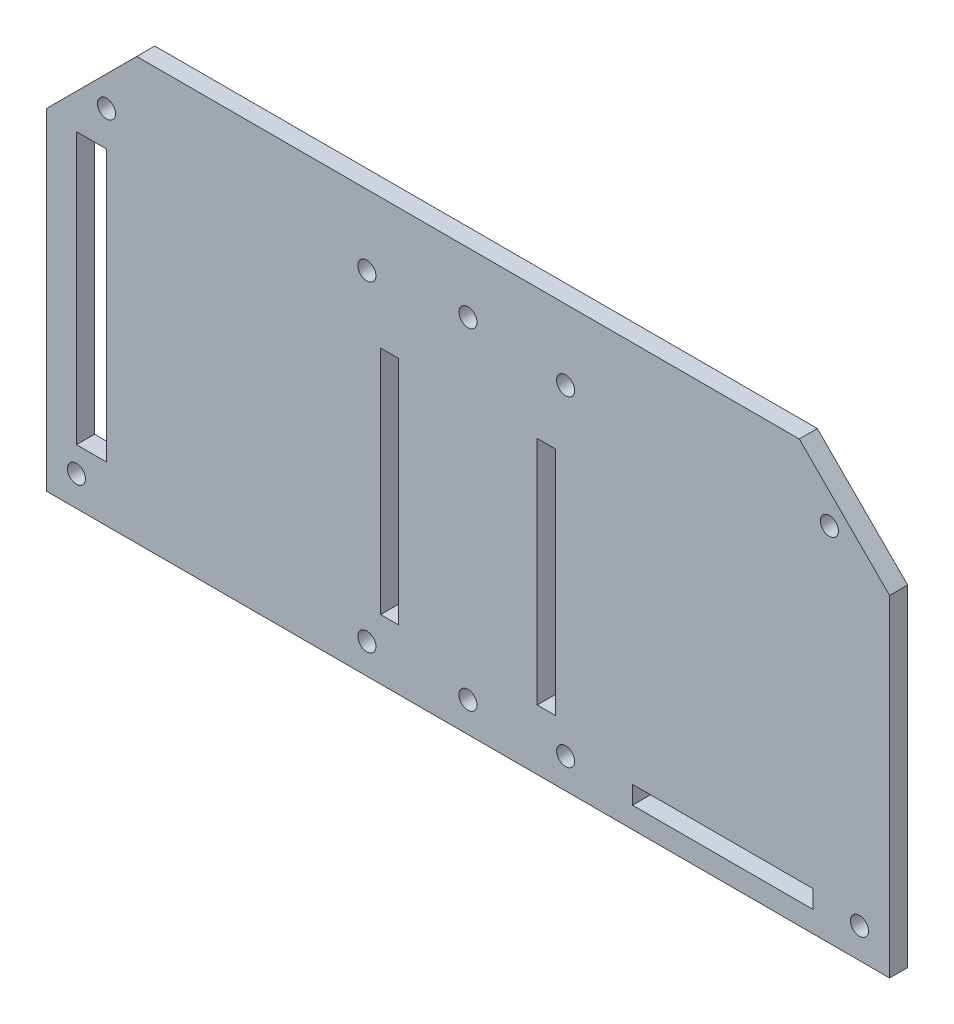
ISO-10303-21;
HEADER;
FILE_DESCRIPTION(('STEP AP214'),'2;1');
FILE_NAME('part.step','',(''),(''),'','','');
FILE_SCHEMA(('AUTOMOTIVE_DESIGN { 1 0 10303 214 1 1 1 1 }'));
ENDSEC;
DATA;
#1=APPLICATION_CONTEXT('core data for automotive mechanical design processes');
#2=APPLICATION_PROTOCOL_DEFINITION('international standard','automotive_design',2000,#1);
#3=PRODUCT_CONTEXT('',#1,'mechanical');
#4=PRODUCT('Part','Part','',(#3));
#5=PRODUCT_RELATED_PRODUCT_CATEGORY('part','',(#4));
#6=PRODUCT_DEFINITION_FORMATION('','',#4);
#7=PRODUCT_DEFINITION_CONTEXT('part definition',#1,'design');
#8=PRODUCT_DEFINITION('design','',#6,#7);
#9=PRODUCT_DEFINITION_SHAPE('','',#8);
#10=(LENGTH_UNIT() NAMED_UNIT(*) SI_UNIT(.MILLI.,.METRE.));
#11=(NAMED_UNIT(*) PLANE_ANGLE_UNIT() SI_UNIT($,.RADIAN.));
#12=(NAMED_UNIT(*) SI_UNIT($,.STERADIAN.) SOLID_ANGLE_UNIT());
#13=UNCERTAINTY_MEASURE_WITH_UNIT(LENGTH_MEASURE(1.E-05),#10,'distance_accuracy_value','');
#14=(GEOMETRIC_REPRESENTATION_CONTEXT(3) GLOBAL_UNCERTAINTY_ASSIGNED_CONTEXT((#13)) GLOBAL_UNIT_ASSIGNED_CONTEXT((#10,
#11,#12)) REPRESENTATION_CONTEXT('',''));
#15=CARTESIAN_POINT('',(0.,0.,0.));
#16=DIRECTION('',(0.,0.,1.));
#17=DIRECTION('',(1.,0.,0.));
#18=AXIS2_PLACEMENT_3D('',#15,#16,#17);
#19=CARTESIAN_POINT('',(70.,-35.,3.));
#20=DIRECTION('',(-1.,0.,0.));
#21=DIRECTION('',(0.,0.,1.));
#22=AXIS2_PLACEMENT_3D('',#19,#20,#21);
#23=PLANE('',#22);
#24=DIRECTION('',(0.,1.,0.));
#25=VECTOR('',#24,1.);
#26=CARTESIAN_POINT('',(70.,-35.,0.));
#27=LINE('',#26,#25);
#28=CARTESIAN_POINT('',(70.,-35.,0.));
#29=VERTEX_POINT('',#28);
#30=CARTESIAN_POINT('',(70.,19.9999999999999,0.));
#31=VERTEX_POINT('',#30);
#32=EDGE_CURVE('E404',#29,#31,#27,.T.);
#33=ORIENTED_EDGE('',*,*,#32,.T.);
#34=DIRECTION('',(0.,0.,1.));
#35=VECTOR('',#34,1.);
#36=CARTESIAN_POINT('',(70.,19.9999999999999,3.));
#37=LINE('',#36,#35);
#38=CARTESIAN_POINT('',(70.,19.9999999999999,3.));
#39=VERTEX_POINT('',#38);
#40=EDGE_CURVE('E11',#31,#39,#37,.T.);
#41=ORIENTED_EDGE('',*,*,#40,.T.);
#42=DIRECTION('',(0.,1.,0.));
#43=VECTOR('',#42,1.);
#44=CARTESIAN_POINT('',(70.,-35.,3.));
#45=LINE('',#44,#43);
#46=CARTESIAN_POINT('',(70.,-35.,3.));
#47=VERTEX_POINT('',#46);
#48=EDGE_CURVE('E448',#47,#39,#45,.T.);
#49=ORIENTED_EDGE('',*,*,#48,.F.);
#50=DIRECTION('',(0.,0.,-1.));
#51=VECTOR('',#50,1.);
#52=CARTESIAN_POINT('',(70.,-35.,3.));
#53=LINE('',#52,#51);
#54=EDGE_CURVE('E463',#47,#29,#53,.T.);
#55=ORIENTED_EDGE('',*,*,#54,.T.);
#56=EDGE_LOOP('',(#33,#41,#49,#55));
#57=FACE_BOUND('',#56,.T.);
#58=ADVANCED_FACE('F47',(#57),#23,.F.);
#59=CARTESIAN_POINT('',(-70.,35.,3.));
#60=DIRECTION('',(0.,-1.,0.));
#61=DIRECTION('',(0.,0.,-1.));
#62=AXIS2_PLACEMENT_3D('',#59,#60,#61);
#63=PLANE('',#62);
#64=DIRECTION('',(-1.,0.,0.));
#65=VECTOR('',#64,1.);
#66=CARTESIAN_POINT('',(-70.,35.,0.));
#67=LINE('',#66,#65);
#68=CARTESIAN_POINT('',(55.,35.,0.));
#69=VERTEX_POINT('',#68);
#70=CARTESIAN_POINT('',(-55.,35.,0.));
#71=VERTEX_POINT('',#70);
#72=EDGE_CURVE('E467',#69,#71,#67,.T.);
#73=ORIENTED_EDGE('',*,*,#72,.T.);
#74=DIRECTION('',(0.,0.,1.));
#75=VECTOR('',#74,1.);
#76=CARTESIAN_POINT('',(-55.,35.,3.));
#77=LINE('',#76,#75);
#78=CARTESIAN_POINT('',(-55.,35.,3.));
#79=VERTEX_POINT('',#78);
#80=EDGE_CURVE('E497',#71,#79,#77,.T.);
#81=ORIENTED_EDGE('',*,*,#80,.T.);
#82=DIRECTION('',(-1.,0.,0.));
#83=VECTOR('',#82,1.);
#84=CARTESIAN_POINT('',(-70.,35.,3.));
#85=LINE('',#84,#83);
#86=CARTESIAN_POINT('',(55.,35.,3.));
#87=VERTEX_POINT('',#86);
#88=EDGE_CURVE('E452',#87,#79,#85,.T.);
#89=ORIENTED_EDGE('',*,*,#88,.F.);
#90=DIRECTION('',(0.,0.,-1.));
#91=VECTOR('',#90,1.);
#92=CARTESIAN_POINT('',(55.,35.,3.));
#93=LINE('',#92,#91);
#94=EDGE_CURVE('E493',#87,#69,#93,.T.);
#95=ORIENTED_EDGE('',*,*,#94,.T.);
#96=EDGE_LOOP('',(#73,#81,#89,#95));
#97=FACE_BOUND('',#96,.T.);
#98=ADVANCED_FACE('F521',(#97),#63,.F.);
#99=CARTESIAN_POINT('',(-70.,-35.,3.));
#100=DIRECTION('',(1.,0.,0.));
#101=DIRECTION('',(0.,0.,-1.));
#102=AXIS2_PLACEMENT_3D('',#99,#100,#101);
#103=PLANE('',#102);
#104=DIRECTION('',(0.,-1.,0.));
#105=VECTOR('',#104,1.);
#106=CARTESIAN_POINT('',(-70.,-35.,3.));
#107=LINE('',#106,#105);
#108=CARTESIAN_POINT('',(-70.,20.,3.));
#109=VERTEX_POINT('',#108);
#110=CARTESIAN_POINT('',(-70.,-35.,3.));
#111=VERTEX_POINT('',#110);
#112=EDGE_CURVE('E457',#109,#111,#107,.T.);
#113=ORIENTED_EDGE('',*,*,#112,.F.);
#114=DIRECTION('',(0.,0.,-1.));
#115=VECTOR('',#114,1.);
#116=CARTESIAN_POINT('',(-70.,20.,3.));
#117=LINE('',#116,#115);
#118=CARTESIAN_POINT('',(-70.,20.,0.));
#119=VERTEX_POINT('',#118);
#120=EDGE_CURVE('E483',#109,#119,#117,.T.);
#121=ORIENTED_EDGE('',*,*,#120,.T.);
#122=DIRECTION('',(0.,-1.,0.));
#123=VECTOR('',#122,1.);
#124=CARTESIAN_POINT('',(-70.,-35.,0.));
#125=LINE('',#124,#123);
#126=CARTESIAN_POINT('',(-70.,-35.,0.));
#127=VERTEX_POINT('',#126);
#128=EDGE_CURVE('E471',#119,#127,#125,.T.);
#129=ORIENTED_EDGE('',*,*,#128,.T.);
#130=DIRECTION('',(0.,0.,-1.));
#131=VECTOR('',#130,1.);
#132=CARTESIAN_POINT('',(-70.,-35.,3.));
#133=LINE('',#132,#131);
#134=EDGE_CURVE('E479',#111,#127,#133,.T.);
#135=ORIENTED_EDGE('',*,*,#134,.F.);
#136=EDGE_LOOP('',(#113,#121,#129,#135));
#137=FACE_BOUND('',#136,.T.);
#138=ADVANCED_FACE('F512',(#137),#103,.F.);
#139=CARTESIAN_POINT('',(-70.,-35.,3.));
#140=DIRECTION('',(0.,1.,0.));
#141=DIRECTION('',(0.,0.,1.));
#142=AXIS2_PLACEMENT_3D('',#139,#140,#141);
#143=PLANE('',#142);
#144=DIRECTION('',(1.,0.,0.));
#145=VECTOR('',#144,1.);
#146=CARTESIAN_POINT('',(-70.,-35.,0.));
#147=LINE('',#146,#145);
#148=EDGE_CURVE('E453',#127,#29,#147,.T.);
#149=ORIENTED_EDGE('',*,*,#148,.T.);
#150=ORIENTED_EDGE('',*,*,#54,.F.);
#151=DIRECTION('',(1.,0.,0.));
#152=VECTOR('',#151,1.);
#153=CARTESIAN_POINT('',(-70.,-35.,3.));
#154=LINE('',#153,#152);
#155=EDGE_CURVE('E460',#111,#47,#154,.T.);
#156=ORIENTED_EDGE('',*,*,#155,.F.);
#157=ORIENTED_EDGE('',*,*,#134,.T.);
#158=EDGE_LOOP('',(#149,#150,#156,#157));
#159=FACE_BOUND('',#158,.T.);
#160=ADVANCED_FACE('F531',(#159),#143,.F.);
#161=CARTESIAN_POINT('',(0.,0.,3.));
#162=DIRECTION('',(0.,0.,-1.));
#163=DIRECTION('',(-1.,0.,0.));
#164=AXIS2_PLACEMENT_3D('',#161,#162,#163);
#165=PLANE('',#164);
#166=CARTESIAN_POINT('',(-16.7839006122835,-30.,3.));
#167=DIRECTION('',(0.,0.,1.));
#168=DIRECTION('',(1.,0.,0.));
#169=AXIS2_PLACEMENT_3D('',#166,#167,#168);
#170=CIRCLE('',#169,1.5);
#171=CARTESIAN_POINT('',(-15.2839006122835,-30.,3.));
#172=VERTEX_POINT('',#171);
#173=EDGE_CURVE('E298',#172,#172,#170,.T.);
#174=ORIENTED_EDGE('',*,*,#173,.F.);
#175=EDGE_LOOP('',(#174));
#176=FACE_BOUND('',#175,.T.);
#177=CARTESIAN_POINT('',(16.2160993877165,23.326321521041,3.));
#178=DIRECTION('',(0.,0.,1.));
#179=DIRECTION('',(1.,0.,0.));
#180=AXIS2_PLACEMENT_3D('',#177,#178,#179);
#181=CIRCLE('',#180,1.5);
#182=CARTESIAN_POINT('',(17.7160993877165,23.326321521041,3.));
#183=VERTEX_POINT('',#182);
#184=EDGE_CURVE('E289',#183,#183,#181,.T.);
#185=ORIENTED_EDGE('',*,*,#184,.F.);
#186=EDGE_LOOP('',(#185));
#187=FACE_BOUND('',#186,.T.);
#188=CARTESIAN_POINT('',(-16.7839006122835,23.326321521041,3.));
#189=DIRECTION('',(0.,0.,1.));
#190=DIRECTION('',(1.,0.,0.));
#191=AXIS2_PLACEMENT_3D('',#188,#189,#190);
#192=CIRCLE('',#191,1.5);
#193=CARTESIAN_POINT('',(-15.2839006122835,23.326321521041,3.));
#194=VERTEX_POINT('',#193);
#195=EDGE_CURVE('E319',#194,#194,#192,.T.);
#196=ORIENTED_EDGE('',*,*,#195,.F.);
#197=EDGE_LOOP('',(#196));
#198=FACE_BOUND('',#197,.T.);
#199=DIRECTION('',(-1.,0.,0.));
#200=VECTOR('',#199,1.);
#201=CARTESIAN_POINT('',(-14.5,13.326321521041,3.));
#202=LINE('',#201,#200);
#203=CARTESIAN_POINT('',(-11.5,13.326321521041,3.));
#204=VERTEX_POINT('',#203);
#205=CARTESIAN_POINT('',(-14.5,13.326321521041,3.));
#206=VERTEX_POINT('',#205);
#207=EDGE_CURVE('E329',#204,#206,#202,.T.);
#208=ORIENTED_EDGE('',*,*,#207,.F.);
#209=DIRECTION('',(0.,1.,0.));
#210=VECTOR('',#209,1.);
#211=CARTESIAN_POINT('',(-11.5,13.326321521041,3.));
#212=LINE('',#211,#210);
#213=CARTESIAN_POINT('',(-11.5,-25.,3.));
#214=VERTEX_POINT('',#213);
#215=EDGE_CURVE('E64',#214,#204,#212,.T.);
#216=ORIENTED_EDGE('',*,*,#215,.F.);
#217=DIRECTION('',(1.,0.,0.));
#218=VECTOR('',#217,1.);
#219=CARTESIAN_POINT('',(-11.5,-25.,3.));
#220=LINE('',#219,#218);
#221=CARTESIAN_POINT('',(-14.5,-25.,3.));
#222=VERTEX_POINT('',#221);
#223=EDGE_CURVE('E320',#222,#214,#220,.T.);
#224=ORIENTED_EDGE('',*,*,#223,.F.);
#225=DIRECTION('',(0.,-1.,0.));
#226=VECTOR('',#225,1.);
#227=CARTESIAN_POINT('',(-14.5,-25.,3.));
#228=LINE('',#227,#226);
#229=EDGE_CURVE('E324',#206,#222,#228,.T.);
#230=ORIENTED_EDGE('',*,*,#229,.F.);
#231=EDGE_LOOP('',(#208,#216,#224,#230));
#232=FACE_BOUND('',#231,.T.);
#233=CARTESIAN_POINT('',(16.2160993877165,-30.,3.));
#234=DIRECTION('',(0.,0.,1.));
#235=DIRECTION('',(1.,0.,0.));
#236=AXIS2_PLACEMENT_3D('',#233,#234,#235);
#237=CIRCLE('',#236,1.5);
#238=CARTESIAN_POINT('',(17.7160993877165,-30.,3.));
#239=VERTEX_POINT('',#238);
#240=EDGE_CURVE('E227',#239,#239,#237,.T.);
#241=ORIENTED_EDGE('',*,*,#240,.F.);
#242=EDGE_LOOP('',(#241));
#243=FACE_BOUND('',#242,.T.);
#244=DIRECTION('',(0.,-1.,0.));
#245=VECTOR('',#244,1.);
#246=CARTESIAN_POINT('',(-65.,19.179923098519,3.));
#247=LINE('',#246,#245);
#248=CARTESIAN_POINT('',(-65.,19.179923098519,3.));
#249=VERTEX_POINT('',#248);
#250=CARTESIAN_POINT('',(-65.,-25.820076901481,3.));
#251=VERTEX_POINT('',#250);
#252=EDGE_CURVE('E220',#249,#251,#247,.T.);
#253=ORIENTED_EDGE('',*,*,#252,.F.);
#254=DIRECTION('',(-1.,0.,0.));
#255=VECTOR('',#254,1.);
#256=CARTESIAN_POINT('',(-60.,19.179923098519,3.));
#257=LINE('',#256,#255);
#258=CARTESIAN_POINT('',(-60.,19.179923098519,3.));
#259=VERTEX_POINT('',#258);
#260=EDGE_CURVE('E72',#259,#249,#257,.T.);
#261=ORIENTED_EDGE('',*,*,#260,.F.);
#262=DIRECTION('',(0.,1.,0.));
#263=VECTOR('',#262,1.);
#264=CARTESIAN_POINT('',(-60.,-25.820076901481,3.));
#265=LINE('',#264,#263);
#266=CARTESIAN_POINT('',(-60.,-25.820076901481,3.));
#267=VERTEX_POINT('',#266);
#268=EDGE_CURVE('E208',#267,#259,#265,.T.);
#269=ORIENTED_EDGE('',*,*,#268,.F.);
#270=DIRECTION('',(1.,0.,0.));
#271=VECTOR('',#270,1.);
#272=CARTESIAN_POINT('',(-65.,-25.820076901481,3.));
#273=LINE('',#272,#271);
#274=EDGE_CURVE('E214',#251,#267,#273,.T.);
#275=ORIENTED_EDGE('',*,*,#274,.F.);
#276=EDGE_LOOP('',(#253,#261,#269,#275));
#277=FACE_BOUND('',#276,.T.);
#278=DIRECTION('',(0.,-1.,0.));
#279=VECTOR('',#278,1.);
#280=CARTESIAN_POINT('',(27.3093976064273,-28.5,3.));
#281=LINE('',#280,#279);
#282=CARTESIAN_POINT('',(27.3093976064273,-28.5,3.));
#283=VERTEX_POINT('',#282);
#284=CARTESIAN_POINT('',(27.3093976064273,-31.5,3.));
#285=VERTEX_POINT('',#284);
#286=EDGE_CURVE('E269',#283,#285,#281,.T.);
#287=ORIENTED_EDGE('',*,*,#286,.F.);
#288=DIRECTION('',(-1.,0.,0.));
#289=VECTOR('',#288,1.);
#290=CARTESIAN_POINT('',(57.3093976064273,-28.5,3.));
#291=LINE('',#290,#289);
#292=CARTESIAN_POINT('',(57.3093976064273,-28.5,3.));
#293=VERTEX_POINT('',#292);
#294=EDGE_CURVE('E205',#293,#283,#291,.T.);
#295=ORIENTED_EDGE('',*,*,#294,.F.);
#296=DIRECTION('',(0.,1.,0.));
#297=VECTOR('',#296,1.);
#298=CARTESIAN_POINT('',(57.3093976064273,-31.5,3.));
#299=LINE('',#298,#297);
#300=CARTESIAN_POINT('',(57.3093976064273,-31.5,3.));
#301=VERTEX_POINT('',#300);
#302=EDGE_CURVE('E260',#301,#293,#299,.T.);
#303=ORIENTED_EDGE('',*,*,#302,.F.);
#304=DIRECTION('',(1.,0.,0.));
#305=VECTOR('',#304,1.);
#306=CARTESIAN_POINT('',(27.3093976064273,-31.5,3.));
#307=LINE('',#306,#305);
#308=EDGE_CURVE('E264',#285,#301,#307,.T.);
#309=ORIENTED_EDGE('',*,*,#308,.F.);
#310=EDGE_LOOP('',(#287,#295,#303,#309));
#311=FACE_BOUND('',#310,.T.);
#312=DIRECTION('',(1.,0.,0.));
#313=VECTOR('',#312,1.);
#314=CARTESIAN_POINT('',(11.5,-25.,3.));
#315=LINE('',#314,#313);
#316=CARTESIAN_POINT('',(11.5,-25.,3.));
#317=VERTEX_POINT('',#316);
#318=CARTESIAN_POINT('',(14.5,-25.,3.));
#319=VERTEX_POINT('',#318);
#320=EDGE_CURVE('E376',#317,#319,#315,.T.);
#321=ORIENTED_EDGE('',*,*,#320,.F.);
#322=DIRECTION('',(0.,-1.,0.));
#323=VECTOR('',#322,1.);
#324=CARTESIAN_POINT('',(11.5,-25.,3.));
#325=LINE('',#324,#323);
#326=CARTESIAN_POINT('',(11.5,13.326321521041,3.));
#327=VERTEX_POINT('',#326);
#328=EDGE_CURVE('E335',#327,#317,#325,.T.);
#329=ORIENTED_EDGE('',*,*,#328,.F.);
#330=DIRECTION('',(-1.,0.,0.));
#331=VECTOR('',#330,1.);
#332=CARTESIAN_POINT('',(11.5,13.326321521041,3.));
#333=LINE('',#332,#331);
#334=CARTESIAN_POINT('',(14.5,13.326321521041,3.));
#335=VERTEX_POINT('',#334);
#336=EDGE_CURVE('E361',#335,#327,#333,.T.);
#337=ORIENTED_EDGE('',*,*,#336,.F.);
#338=DIRECTION('',(0.,1.,0.));
#339=VECTOR('',#338,1.);
#340=CARTESIAN_POINT('',(14.5,-25.,3.));
#341=LINE('',#340,#339);
#342=EDGE_CURVE('E380',#319,#335,#341,.T.);
#343=ORIENTED_EDGE('',*,*,#342,.F.);
#344=EDGE_LOOP('',(#321,#329,#337,#343));
#345=FACE_BOUND('',#344,.T.);
#346=CARTESIAN_POINT('',(-65.,-30.,3.));
#347=DIRECTION('',(0.,0.,1.));
#348=DIRECTION('',(1.,0.,0.));
#349=AXIS2_PLACEMENT_3D('',#346,#347,#348);
#350=CIRCLE('',#349,1.5);
#351=CARTESIAN_POINT('',(-63.5,-30.,3.));
#352=VERTEX_POINT('',#351);
#353=EDGE_CURVE('E405',#352,#352,#350,.T.);
#354=ORIENTED_EDGE('',*,*,#353,.F.);
#355=EDGE_LOOP('',(#354));
#356=FACE_BOUND('',#355,.T.);
#357=CARTESIAN_POINT('',(0.,25.,3.));
#358=DIRECTION('',(0.,0.,1.));
#359=DIRECTION('',(1.,0.,0.));
#360=AXIS2_PLACEMENT_3D('',#357,#358,#359);
#361=CIRCLE('',#360,1.5);
#362=CARTESIAN_POINT('',(1.5,25.,3.));
#363=VERTEX_POINT('',#362);
#364=EDGE_CURVE('E410',#363,#363,#361,.T.);
#365=ORIENTED_EDGE('',*,*,#364,.F.);
#366=EDGE_LOOP('',(#365));
#367=FACE_BOUND('',#366,.T.);
#368=CARTESIAN_POINT('',(60.,25.,3.));
#369=DIRECTION('',(0.,0.,1.));
#370=DIRECTION('',(1.,0.,0.));
#371=AXIS2_PLACEMENT_3D('',#368,#369,#370);
#372=CIRCLE('',#371,1.5);
#373=CARTESIAN_POINT('',(61.5,25.,3.));
#374=VERTEX_POINT('',#373);
#375=EDGE_CURVE('E441',#374,#374,#372,.T.);
#376=ORIENTED_EDGE('',*,*,#375,.F.);
#377=EDGE_LOOP('',(#376));
#378=FACE_BOUND('',#377,.T.);
#379=CARTESIAN_POINT('',(-60.,25.,3.));
#380=DIRECTION('',(0.,0.,1.));
#381=DIRECTION('',(1.,0.,0.));
#382=AXIS2_PLACEMENT_3D('',#379,#380,#381);
#383=CIRCLE('',#382,1.5);
#384=CARTESIAN_POINT('',(-58.5,25.,3.));
#385=VERTEX_POINT('',#384);
#386=EDGE_CURVE('E433',#385,#385,#383,.T.);
#387=ORIENTED_EDGE('',*,*,#386,.F.);
#388=EDGE_LOOP('',(#387));
#389=FACE_BOUND('',#388,.T.);
#390=CARTESIAN_POINT('',(0.,-30.,3.));
#391=DIRECTION('',(0.,0.,1.));
#392=DIRECTION('',(1.,0.,0.));
#393=AXIS2_PLACEMENT_3D('',#390,#391,#392);
#394=CIRCLE('',#393,1.5);
#395=CARTESIAN_POINT('',(1.5,-30.,3.));
#396=VERTEX_POINT('',#395);
#397=EDGE_CURVE('E425',#396,#396,#394,.T.);
#398=ORIENTED_EDGE('',*,*,#397,.F.);
#399=EDGE_LOOP('',(#398));
#400=FACE_BOUND('',#399,.T.);
#401=CARTESIAN_POINT('',(65.,-30.,3.));
#402=DIRECTION('',(0.,0.,1.));
#403=DIRECTION('',(1.,0.,0.));
#404=AXIS2_PLACEMENT_3D('',#401,#402,#403);
#405=CIRCLE('',#404,1.5);
#406=CARTESIAN_POINT('',(66.5,-30.,3.));
#407=VERTEX_POINT('',#406);
#408=EDGE_CURVE('E409',#407,#407,#405,.T.);
#409=ORIENTED_EDGE('',*,*,#408,.F.);
#410=EDGE_LOOP('',(#409));
#411=FACE_BOUND('',#410,.T.);
#412=ORIENTED_EDGE('',*,*,#88,.T.);
#413=DIRECTION('',(0.707106781186549,0.707106781186547,0.));
#414=VECTOR('',#413,1.);
#415=CARTESIAN_POINT('',(-70.,20.,3.));
#416=LINE('',#415,#414);
#417=EDGE_CURVE('E57',#79,#109,#416,.F.);
#418=ORIENTED_EDGE('',*,*,#417,.T.);
#419=ORIENTED_EDGE('',*,*,#112,.T.);
#420=ORIENTED_EDGE('',*,*,#155,.T.);
#421=ORIENTED_EDGE('',*,*,#48,.T.);
#422=DIRECTION('',(0.707106781186546,-0.707106781186549,0.));
#423=VECTOR('',#422,1.);
#424=CARTESIAN_POINT('',(55.,35.,3.));
#425=LINE('',#424,#423);
#426=EDGE_CURVE('E500',#39,#87,#425,.F.);
#427=ORIENTED_EDGE('',*,*,#426,.T.);
#428=EDGE_LOOP('',(#412,#418,#419,#420,#421,#427));
#429=FACE_BOUND('',#428,.T.);
#430=ADVANCED_FACE('F217',(#176,#187,#198,#232,#243,#277,#311,#345,#356,#367,#378,#389,#400,
#411,#429),#165,.F.);
#431=CARTESIAN_POINT('',(0.,0.,0.));
#432=DIRECTION('',(0.,0.,-1.));
#433=DIRECTION('',(-1.,0.,0.));
#434=AXIS2_PLACEMENT_3D('',#431,#432,#433);
#435=PLANE('',#434);
#436=CARTESIAN_POINT('',(-16.7839006122835,-30.,0.));
#437=DIRECTION('',(0.,0.,1.));
#438=DIRECTION('',(1.,0.,0.));
#439=AXIS2_PLACEMENT_3D('',#436,#437,#438);
#440=CIRCLE('',#439,1.5);
#441=CARTESIAN_POINT('',(-15.2839006122835,-30.,0.));
#442=VERTEX_POINT('',#441);
#443=EDGE_CURVE('E302',#442,#442,#440,.T.);
#444=ORIENTED_EDGE('',*,*,#443,.T.);
#445=EDGE_LOOP('',(#444));
#446=FACE_BOUND('',#445,.T.);
#447=CARTESIAN_POINT('',(16.2160993877165,23.326321521041,0.));
#448=DIRECTION('',(0.,0.,1.));
#449=DIRECTION('',(1.,0.,0.));
#450=AXIS2_PLACEMENT_3D('',#447,#448,#449);
#451=CIRCLE('',#450,1.5);
#452=CARTESIAN_POINT('',(17.7160993877165,23.326321521041,0.));
#453=VERTEX_POINT('',#452);
#454=EDGE_CURVE('E294',#453,#453,#451,.T.);
#455=ORIENTED_EDGE('',*,*,#454,.T.);
#456=EDGE_LOOP('',(#455));
#457=FACE_BOUND('',#456,.T.);
#458=CARTESIAN_POINT('',(-16.7839006122835,23.326321521041,0.));
#459=DIRECTION('',(0.,0.,1.));
#460=DIRECTION('',(1.,0.,0.));
#461=AXIS2_PLACEMENT_3D('',#458,#459,#460);
#462=CIRCLE('',#461,1.5);
#463=CARTESIAN_POINT('',(-15.2839006122835,23.326321521041,0.));
#464=VERTEX_POINT('',#463);
#465=EDGE_CURVE('E293',#464,#464,#462,.T.);
#466=ORIENTED_EDGE('',*,*,#465,.T.);
#467=EDGE_LOOP('',(#466));
#468=FACE_BOUND('',#467,.T.);
#469=DIRECTION('',(0.,1.,0.));
#470=VECTOR('',#469,1.);
#471=CARTESIAN_POINT('',(-11.5,13.326321521041,0.));
#472=LINE('',#471,#470);
#473=CARTESIAN_POINT('',(-11.5,-25.,0.));
#474=VERTEX_POINT('',#473);
#475=CARTESIAN_POINT('',(-11.5,13.326321521041,0.));
#476=VERTEX_POINT('',#475);
#477=EDGE_CURVE('E325',#474,#476,#472,.T.);
#478=ORIENTED_EDGE('',*,*,#477,.T.);
#479=DIRECTION('',(-1.,0.,0.));
#480=VECTOR('',#479,1.);
#481=CARTESIAN_POINT('',(-14.5,13.326321521041,0.));
#482=LINE('',#481,#480);
#483=CARTESIAN_POINT('',(-14.5,13.326321521041,0.));
#484=VERTEX_POINT('',#483);
#485=EDGE_CURVE('E343',#476,#484,#482,.T.);
#486=ORIENTED_EDGE('',*,*,#485,.T.);
#487=DIRECTION('',(0.,-1.,0.));
#488=VECTOR('',#487,1.);
#489=CARTESIAN_POINT('',(-14.5,-25.,0.));
#490=LINE('',#489,#488);
#491=CARTESIAN_POINT('',(-14.5,-25.,0.));
#492=VERTEX_POINT('',#491);
#493=EDGE_CURVE('E339',#484,#492,#490,.T.);
#494=ORIENTED_EDGE('',*,*,#493,.T.);
#495=DIRECTION('',(1.,0.,0.));
#496=VECTOR('',#495,1.);
#497=CARTESIAN_POINT('',(-11.5,-25.,0.));
#498=LINE('',#497,#496);
#499=EDGE_CURVE('E309',#492,#474,#498,.T.);
#500=ORIENTED_EDGE('',*,*,#499,.T.);
#501=EDGE_LOOP('',(#478,#486,#494,#500));
#502=FACE_BOUND('',#501,.T.);
#503=CARTESIAN_POINT('',(16.2160993877165,-30.,0.));
#504=DIRECTION('',(0.,0.,1.));
#505=DIRECTION('',(1.,0.,0.));
#506=AXIS2_PLACEMENT_3D('',#503,#504,#505);
#507=CIRCLE('',#506,1.5);
#508=CARTESIAN_POINT('',(17.7160993877165,-30.,0.));
#509=VERTEX_POINT('',#508);
#510=EDGE_CURVE('E222',#509,#509,#507,.T.);
#511=ORIENTED_EDGE('',*,*,#510,.T.);
#512=EDGE_LOOP('',(#511));
#513=FACE_BOUND('',#512,.T.);
#514=DIRECTION('',(-1.,0.,0.));
#515=VECTOR('',#514,1.);
#516=CARTESIAN_POINT('',(-60.,19.179923098519,0.));
#517=LINE('',#516,#515);
#518=CARTESIAN_POINT('',(-60.,19.179923098519,0.));
#519=VERTEX_POINT('',#518);
#520=CARTESIAN_POINT('',(-65.,19.179923098519,0.));
#521=VERTEX_POINT('',#520);
#522=EDGE_CURVE('E199',#519,#521,#517,.T.);
#523=ORIENTED_EDGE('',*,*,#522,.T.);
#524=DIRECTION('',(0.,-1.,0.));
#525=VECTOR('',#524,1.);
#526=CARTESIAN_POINT('',(-65.,19.179923098519,0.));
#527=LINE('',#526,#525);
#528=CARTESIAN_POINT('',(-65.,-25.820076901481,0.));
#529=VERTEX_POINT('',#528);
#530=EDGE_CURVE('E240',#521,#529,#527,.T.);
#531=ORIENTED_EDGE('',*,*,#530,.T.);
#532=DIRECTION('',(1.,0.,0.));
#533=VECTOR('',#532,1.);
#534=CARTESIAN_POINT('',(-65.,-25.820076901481,0.));
#535=LINE('',#534,#533);
#536=CARTESIAN_POINT('',(-60.,-25.820076901481,0.));
#537=VERTEX_POINT('',#536);
#538=EDGE_CURVE('E235',#529,#537,#535,.T.);
#539=ORIENTED_EDGE('',*,*,#538,.T.);
#540=DIRECTION('',(0.,1.,0.));
#541=VECTOR('',#540,1.);
#542=CARTESIAN_POINT('',(-60.,-25.820076901481,0.));
#543=LINE('',#542,#541);
#544=EDGE_CURVE('E232',#537,#519,#543,.T.);
#545=ORIENTED_EDGE('',*,*,#544,.T.);
#546=EDGE_LOOP('',(#523,#531,#539,#545));
#547=FACE_BOUND('',#546,.T.);
#548=DIRECTION('',(-1.,0.,0.));
#549=VECTOR('',#548,1.);
#550=CARTESIAN_POINT('',(57.3093976064273,-28.5,0.));
#551=LINE('',#550,#549);
#552=CARTESIAN_POINT('',(57.3093976064273,-28.5,0.));
#553=VERTEX_POINT('',#552);
#554=CARTESIAN_POINT('',(27.3093976064273,-28.5,0.));
#555=VERTEX_POINT('',#554);
#556=EDGE_CURVE('E265',#553,#555,#551,.T.);
#557=ORIENTED_EDGE('',*,*,#556,.T.);
#558=DIRECTION('',(0.,-1.,0.));
#559=VECTOR('',#558,1.);
#560=CARTESIAN_POINT('',(27.3093976064273,-28.5,0.));
#561=LINE('',#560,#559);
#562=CARTESIAN_POINT('',(27.3093976064273,-31.5,0.));
#563=VERTEX_POINT('',#562);
#564=EDGE_CURVE('E282',#555,#563,#561,.T.);
#565=ORIENTED_EDGE('',*,*,#564,.T.);
#566=DIRECTION('',(1.,0.,0.));
#567=VECTOR('',#566,1.);
#568=CARTESIAN_POINT('',(27.3093976064273,-31.5,0.));
#569=LINE('',#568,#567);
#570=CARTESIAN_POINT('',(57.3093976064273,-31.5,0.));
#571=VERTEX_POINT('',#570);
#572=EDGE_CURVE('E278',#563,#571,#569,.T.);
#573=ORIENTED_EDGE('',*,*,#572,.T.);
#574=DIRECTION('',(0.,1.,0.));
#575=VECTOR('',#574,1.);
#576=CARTESIAN_POINT('',(57.3093976064273,-31.5,0.));
#577=LINE('',#576,#575);
#578=EDGE_CURVE('E250',#571,#553,#577,.T.);
#579=ORIENTED_EDGE('',*,*,#578,.T.);
#580=EDGE_LOOP('',(#557,#565,#573,#579));
#581=FACE_BOUND('',#580,.T.);
#582=DIRECTION('',(0.,-1.,0.));
#583=VECTOR('',#582,1.);
#584=CARTESIAN_POINT('',(11.5,-25.,0.));
#585=LINE('',#584,#583);
#586=CARTESIAN_POINT('',(11.5,13.326321521041,0.));
#587=VERTEX_POINT('',#586);
#588=CARTESIAN_POINT('',(11.5,-25.,0.));
#589=VERTEX_POINT('',#588);
#590=EDGE_CURVE('E356',#587,#589,#585,.T.);
#591=ORIENTED_EDGE('',*,*,#590,.T.);
#592=DIRECTION('',(1.,0.,0.));
#593=VECTOR('',#592,1.);
#594=CARTESIAN_POINT('',(11.5,-25.,0.));
#595=LINE('',#594,#593);
#596=CARTESIAN_POINT('',(14.5,-25.,0.));
#597=VERTEX_POINT('',#596);
#598=EDGE_CURVE('E360',#589,#597,#595,.T.);
#599=ORIENTED_EDGE('',*,*,#598,.T.);
#600=DIRECTION('',(0.,1.,0.));
#601=VECTOR('',#600,1.);
#602=CARTESIAN_POINT('',(14.5,-25.,0.));
#603=LINE('',#602,#601);
#604=CARTESIAN_POINT('',(14.5,13.326321521041,0.));
#605=VERTEX_POINT('',#604);
#606=EDGE_CURVE('E365',#597,#605,#603,.T.);
#607=ORIENTED_EDGE('',*,*,#606,.T.);
#608=DIRECTION('',(-1.,0.,0.));
#609=VECTOR('',#608,1.);
#610=CARTESIAN_POINT('',(11.5,13.326321521041,0.));
#611=LINE('',#610,#609);
#612=EDGE_CURVE('E369',#605,#587,#611,.T.);
#613=ORIENTED_EDGE('',*,*,#612,.T.);
#614=EDGE_LOOP('',(#591,#599,#607,#613));
#615=FACE_BOUND('',#614,.T.);
#616=CARTESIAN_POINT('',(-65.,-30.,0.));
#617=DIRECTION('',(0.,0.,1.));
#618=DIRECTION('',(1.,0.,0.));
#619=AXIS2_PLACEMENT_3D('',#616,#617,#618);
#620=CIRCLE('',#619,1.5);
#621=CARTESIAN_POINT('',(-63.5,-30.,0.));
#622=VERTEX_POINT('',#621);
#623=EDGE_CURVE('E400',#622,#622,#620,.T.);
#624=ORIENTED_EDGE('',*,*,#623,.T.);
#625=EDGE_LOOP('',(#624));
#626=FACE_BOUND('',#625,.T.);
#627=CARTESIAN_POINT('',(0.,25.,0.));
#628=DIRECTION('',(0.,0.,1.));
#629=DIRECTION('',(1.,0.,0.));
#630=AXIS2_PLACEMENT_3D('',#627,#628,#629);
#631=CIRCLE('',#630,1.5);
#632=CARTESIAN_POINT('',(1.5,25.,0.));
#633=VERTEX_POINT('',#632);
#634=EDGE_CURVE('E390',#633,#633,#631,.T.);
#635=ORIENTED_EDGE('',*,*,#634,.T.);
#636=EDGE_LOOP('',(#635));
#637=FACE_BOUND('',#636,.T.);
#638=CARTESIAN_POINT('',(60.,25.,0.));
#639=DIRECTION('',(0.,0.,1.));
#640=DIRECTION('',(1.,0.,0.));
#641=AXIS2_PLACEMENT_3D('',#638,#639,#640);
#642=CIRCLE('',#641,1.5);
#643=CARTESIAN_POINT('',(61.5,25.,0.));
#644=VERTEX_POINT('',#643);
#645=EDGE_CURVE('E414',#644,#644,#642,.T.);
#646=ORIENTED_EDGE('',*,*,#645,.T.);
#647=EDGE_LOOP('',(#646));
#648=FACE_BOUND('',#647,.T.);
#649=CARTESIAN_POINT('',(-60.,25.,0.));
#650=DIRECTION('',(0.,0.,1.));
#651=DIRECTION('',(1.,0.,0.));
#652=AXIS2_PLACEMENT_3D('',#649,#650,#651);
#653=CIRCLE('',#652,1.5);
#654=CARTESIAN_POINT('',(-58.5,25.,0.));
#655=VERTEX_POINT('',#654);
#656=EDGE_CURVE('E437',#655,#655,#653,.T.);
#657=ORIENTED_EDGE('',*,*,#656,.T.);
#658=EDGE_LOOP('',(#657));
#659=FACE_BOUND('',#658,.T.);
#660=CARTESIAN_POINT('',(0.,-30.,0.));
#661=DIRECTION('',(0.,0.,1.));
#662=DIRECTION('',(1.,0.,0.));
#663=AXIS2_PLACEMENT_3D('',#660,#661,#662);
#664=CIRCLE('',#663,1.5);
#665=CARTESIAN_POINT('',(1.5,-30.,0.));
#666=VERTEX_POINT('',#665);
#667=EDGE_CURVE('E429',#666,#666,#664,.T.);
#668=ORIENTED_EDGE('',*,*,#667,.T.);
#669=EDGE_LOOP('',(#668));
#670=FACE_BOUND('',#669,.T.);
#671=CARTESIAN_POINT('',(65.,-30.,0.));
#672=DIRECTION('',(0.,0.,1.));
#673=DIRECTION('',(1.,0.,0.));
#674=AXIS2_PLACEMENT_3D('',#671,#672,#673);
#675=CIRCLE('',#674,1.5);
#676=CARTESIAN_POINT('',(66.5,-30.,0.));
#677=VERTEX_POINT('',#676);
#678=EDGE_CURVE('E421',#677,#677,#675,.T.);
#679=ORIENTED_EDGE('',*,*,#678,.T.);
#680=EDGE_LOOP('',(#679));
#681=FACE_BOUND('',#680,.T.);
#682=ORIENTED_EDGE('',*,*,#128,.F.);
#683=DIRECTION('',(-0.707106781186549,-0.707106781186547,0.));
#684=VECTOR('',#683,1.);
#685=CARTESIAN_POINT('',(-44.9999999999999,45.,0.));
#686=LINE('',#685,#684);
#687=EDGE_CURVE('E490',#119,#71,#686,.F.);
#688=ORIENTED_EDGE('',*,*,#687,.T.);
#689=ORIENTED_EDGE('',*,*,#72,.F.);
#690=DIRECTION('',(-0.707106781186546,0.707106781186549,0.));
#691=VECTOR('',#690,1.);
#692=CARTESIAN_POINT('',(45.0000000000001,44.9999999999999,0.));
#693=LINE('',#692,#691);
#694=EDGE_CURVE('E487',#69,#31,#693,.F.);
#695=ORIENTED_EDGE('',*,*,#694,.T.);
#696=ORIENTED_EDGE('',*,*,#32,.F.);
#697=ORIENTED_EDGE('',*,*,#148,.F.);
#698=EDGE_LOOP('',(#682,#688,#689,#695,#696,#697));
#699=FACE_BOUND('',#698,.T.);
#700=ADVANCED_FACE('F518',(#446,#457,#468,#502,#513,#547,#581,#615,#626,#637,#648,#659,#670,
#681,#699),#435,.T.);
#701=CARTESIAN_POINT('',(65.,-30.,0.));
#702=DIRECTION('',(0.,0.,1.));
#703=DIRECTION('',(1.,0.,0.));
#704=AXIS2_PLACEMENT_3D('',#701,#702,#703);
#705=CYLINDRICAL_SURFACE('',#704,1.5);
#706=ORIENTED_EDGE('',*,*,#678,.F.);
#707=EDGE_LOOP('',(#706));
#708=FACE_BOUND('',#707,.T.);
#709=ORIENTED_EDGE('',*,*,#408,.T.);
#710=EDGE_LOOP('',(#709));
#711=FACE_BOUND('',#710,.T.);
#712=ADVANCED_FACE('F573',(#708,#711),#705,.F.);
#713=CARTESIAN_POINT('',(0.,-30.,0.));
#714=DIRECTION('',(0.,0.,1.));
#715=DIRECTION('',(1.,0.,0.));
#716=AXIS2_PLACEMENT_3D('',#713,#714,#715);
#717=CYLINDRICAL_SURFACE('',#716,1.5);
#718=ORIENTED_EDGE('',*,*,#667,.F.);
#719=EDGE_LOOP('',(#718));
#720=FACE_BOUND('',#719,.T.);
#721=ORIENTED_EDGE('',*,*,#397,.T.);
#722=EDGE_LOOP('',(#721));
#723=FACE_BOUND('',#722,.T.);
#724=ADVANCED_FACE('F575',(#720,#723),#717,.F.);
#725=CARTESIAN_POINT('',(-60.,25.,0.));
#726=DIRECTION('',(0.,0.,1.));
#727=DIRECTION('',(1.,0.,0.));
#728=AXIS2_PLACEMENT_3D('',#725,#726,#727);
#729=CYLINDRICAL_SURFACE('',#728,1.5);
#730=ORIENTED_EDGE('',*,*,#656,.F.);
#731=EDGE_LOOP('',(#730));
#732=FACE_BOUND('',#731,.T.);
#733=ORIENTED_EDGE('',*,*,#386,.T.);
#734=EDGE_LOOP('',(#733));
#735=FACE_BOUND('',#734,.T.);
#736=ADVANCED_FACE('F579',(#732,#735),#729,.F.);
#737=CARTESIAN_POINT('',(60.,25.,0.));
#738=DIRECTION('',(0.,0.,1.));
#739=DIRECTION('',(1.,0.,0.));
#740=AXIS2_PLACEMENT_3D('',#737,#738,#739);
#741=CYLINDRICAL_SURFACE('',#740,1.5);
#742=ORIENTED_EDGE('',*,*,#645,.F.);
#743=EDGE_LOOP('',(#742));
#744=FACE_BOUND('',#743,.T.);
#745=ORIENTED_EDGE('',*,*,#375,.T.);
#746=EDGE_LOOP('',(#745));
#747=FACE_BOUND('',#746,.T.);
#748=ADVANCED_FACE('F565',(#744,#747),#741,.F.);
#749=CARTESIAN_POINT('',(0.,25.,0.));
#750=DIRECTION('',(0.,0.,1.));
#751=DIRECTION('',(1.,0.,0.));
#752=AXIS2_PLACEMENT_3D('',#749,#750,#751);
#753=CYLINDRICAL_SURFACE('',#752,1.5);
#754=ORIENTED_EDGE('',*,*,#634,.F.);
#755=EDGE_LOOP('',(#754));
#756=FACE_BOUND('',#755,.T.);
#757=ORIENTED_EDGE('',*,*,#364,.T.);
#758=EDGE_LOOP('',(#757));
#759=FACE_BOUND('',#758,.T.);
#760=ADVANCED_FACE('F559',(#756,#759),#753,.F.);
#761=CARTESIAN_POINT('',(-65.,-30.,0.));
#762=DIRECTION('',(0.,0.,1.));
#763=DIRECTION('',(1.,0.,0.));
#764=AXIS2_PLACEMENT_3D('',#761,#762,#763);
#765=CYLINDRICAL_SURFACE('',#764,1.5);
#766=ORIENTED_EDGE('',*,*,#623,.F.);
#767=EDGE_LOOP('',(#766));
#768=FACE_BOUND('',#767,.T.);
#769=ORIENTED_EDGE('',*,*,#353,.T.);
#770=EDGE_LOOP('',(#769));
#771=FACE_BOUND('',#770,.T.);
#772=ADVANCED_FACE('F554',(#768,#771),#765,.F.);
#773=CARTESIAN_POINT('',(-70.,20.,3.));
#774=DIRECTION('',(0.707106781186546,-0.707106781186548,0.));
#775=DIRECTION('',(0.,0.,-1.));
#776=AXIS2_PLACEMENT_3D('',#773,#774,#775);
#777=PLANE('',#776);
#778=ORIENTED_EDGE('',*,*,#417,.F.);
#779=ORIENTED_EDGE('',*,*,#80,.F.);
#780=ORIENTED_EDGE('',*,*,#687,.F.);
#781=ORIENTED_EDGE('',*,*,#120,.F.);
#782=EDGE_LOOP('',(#778,#779,#780,#781));
#783=FACE_BOUND('',#782,.T.);
#784=ADVANCED_FACE('F515',(#783),#777,.F.);
#785=CARTESIAN_POINT('',(55.,35.,3.));
#786=DIRECTION('',(-0.707106781186549,-0.707106781186546,0.));
#787=DIRECTION('',(0.,0.,-1.));
#788=AXIS2_PLACEMENT_3D('',#785,#786,#787);
#789=PLANE('',#788);
#790=ORIENTED_EDGE('',*,*,#426,.F.);
#791=ORIENTED_EDGE('',*,*,#40,.F.);
#792=ORIENTED_EDGE('',*,*,#694,.F.);
#793=ORIENTED_EDGE('',*,*,#94,.F.);
#794=EDGE_LOOP('',(#790,#791,#792,#793));
#795=FACE_BOUND('',#794,.T.);
#796=ADVANCED_FACE('F50',(#795),#789,.F.);
#797=CARTESIAN_POINT('',(11.5,-25.,0.));
#798=DIRECTION('',(-1.,0.,0.));
#799=DIRECTION('',(0.,0.,1.));
#800=AXIS2_PLACEMENT_3D('',#797,#798,#799);
#801=PLANE('',#800);
#802=ORIENTED_EDGE('',*,*,#328,.T.);
#803=DIRECTION('',(0.,0.,1.));
#804=VECTOR('',#803,1.);
#805=CARTESIAN_POINT('',(11.5,-25.,0.));
#806=LINE('',#805,#804);
#807=EDGE_CURVE('E373',#589,#317,#806,.T.);
#808=ORIENTED_EDGE('',*,*,#807,.F.);
#809=ORIENTED_EDGE('',*,*,#590,.F.);
#810=DIRECTION('',(0.,0.,1.));
#811=VECTOR('',#810,1.);
#812=CARTESIAN_POINT('',(11.5,13.326321521041,0.));
#813=LINE('',#812,#811);
#814=EDGE_CURVE('E387',#587,#327,#813,.T.);
#815=ORIENTED_EDGE('',*,*,#814,.T.);
#816=EDGE_LOOP('',(#802,#808,#809,#815));
#817=FACE_BOUND('',#816,.T.);
#818=ADVANCED_FACE('F558',(#817),#801,.F.);
#819=CARTESIAN_POINT('',(11.5,13.326321521041,0.));
#820=DIRECTION('',(0.,1.,0.));
#821=DIRECTION('',(0.,0.,1.));
#822=AXIS2_PLACEMENT_3D('',#819,#820,#821);
#823=PLANE('',#822);
#824=ORIENTED_EDGE('',*,*,#336,.T.);
#825=ORIENTED_EDGE('',*,*,#814,.F.);
#826=ORIENTED_EDGE('',*,*,#612,.F.);
#827=DIRECTION('',(0.,0.,1.));
#828=VECTOR('',#827,1.);
#829=CARTESIAN_POINT('',(14.5,13.326321521041,0.));
#830=LINE('',#829,#828);
#831=EDGE_CURVE('E391',#605,#335,#830,.T.);
#832=ORIENTED_EDGE('',*,*,#831,.T.);
#833=EDGE_LOOP('',(#824,#825,#826,#832));
#834=FACE_BOUND('',#833,.T.);
#835=ADVANCED_FACE('F644',(#834),#823,.F.);
#836=CARTESIAN_POINT('',(14.5,-25.,0.));
#837=DIRECTION('',(1.,0.,0.));
#838=DIRECTION('',(0.,1.,0.));
#839=AXIS2_PLACEMENT_3D('',#836,#837,#838);
#840=PLANE('',#839);
#841=ORIENTED_EDGE('',*,*,#342,.T.);
#842=ORIENTED_EDGE('',*,*,#831,.F.);
#843=ORIENTED_EDGE('',*,*,#606,.F.);
#844=DIRECTION('',(0.,0.,1.));
#845=VECTOR('',#844,1.);
#846=CARTESIAN_POINT('',(14.5,-25.,0.));
#847=LINE('',#846,#845);
#848=EDGE_CURVE('E394',#597,#319,#847,.T.);
#849=ORIENTED_EDGE('',*,*,#848,.T.);
#850=EDGE_LOOP('',(#841,#842,#843,#849));
#851=FACE_BOUND('',#850,.T.);
#852=ADVANCED_FACE('F641',(#851),#840,.F.);
#853=CARTESIAN_POINT('',(11.5,-25.,0.));
#854=DIRECTION('',(0.,-1.,0.));
#855=DIRECTION('',(0.,0.,-1.));
#856=AXIS2_PLACEMENT_3D('',#853,#854,#855);
#857=PLANE('',#856);
#858=ORIENTED_EDGE('',*,*,#320,.T.);
#859=ORIENTED_EDGE('',*,*,#848,.F.);
#860=ORIENTED_EDGE('',*,*,#598,.F.);
#861=ORIENTED_EDGE('',*,*,#807,.T.);
#862=EDGE_LOOP('',(#858,#859,#860,#861));
#863=FACE_BOUND('',#862,.T.);
#864=ADVANCED_FACE('F638',(#863),#857,.F.);
#865=CARTESIAN_POINT('',(57.3093976064273,-28.5,0.));
#866=DIRECTION('',(0.,1.,0.));
#867=DIRECTION('',(0.,0.,1.));
#868=AXIS2_PLACEMENT_3D('',#865,#866,#867);
#869=PLANE('',#868);
#870=ORIENTED_EDGE('',*,*,#294,.T.);
#871=DIRECTION('',(0.,0.,1.));
#872=VECTOR('',#871,1.);
#873=CARTESIAN_POINT('',(27.3093976064273,-28.5,0.));
#874=LINE('',#873,#872);
#875=EDGE_CURVE('E246',#555,#283,#874,.T.);
#876=ORIENTED_EDGE('',*,*,#875,.F.);
#877=ORIENTED_EDGE('',*,*,#556,.F.);
#878=DIRECTION('',(0.,0.,1.));
#879=VECTOR('',#878,1.);
#880=CARTESIAN_POINT('',(57.3093976064273,-28.5,0.));
#881=LINE('',#880,#879);
#882=EDGE_CURVE('E257',#553,#293,#881,.T.);
#883=ORIENTED_EDGE('',*,*,#882,.T.);
#884=EDGE_LOOP('',(#870,#876,#877,#883));
#885=FACE_BOUND('',#884,.T.);
#886=ADVANCED_FACE('F658',(#885),#869,.F.);
#887=CARTESIAN_POINT('',(57.3093976064273,-31.5,0.));
#888=DIRECTION('',(1.,0.,0.));
#889=DIRECTION('',(0.,0.,-1.));
#890=AXIS2_PLACEMENT_3D('',#887,#888,#889);
#891=PLANE('',#890);
#892=ORIENTED_EDGE('',*,*,#302,.T.);
#893=ORIENTED_EDGE('',*,*,#882,.F.);
#894=ORIENTED_EDGE('',*,*,#578,.F.);
#895=DIRECTION('',(0.,0.,1.));
#896=VECTOR('',#895,1.);
#897=CARTESIAN_POINT('',(57.3093976064273,-31.5,0.));
#898=LINE('',#897,#896);
#899=EDGE_CURVE('E254',#571,#301,#898,.T.);
#900=ORIENTED_EDGE('',*,*,#899,.T.);
#901=EDGE_LOOP('',(#892,#893,#894,#900));
#902=FACE_BOUND('',#901,.T.);
#903=ADVANCED_FACE('F662',(#902),#891,.F.);
#904=CARTESIAN_POINT('',(27.3093976064273,-31.5,0.));
#905=DIRECTION('',(0.,-1.,0.));
#906=DIRECTION('',(0.,0.,-1.));
#907=AXIS2_PLACEMENT_3D('',#904,#905,#906);
#908=PLANE('',#907);
#909=ORIENTED_EDGE('',*,*,#308,.T.);
#910=ORIENTED_EDGE('',*,*,#899,.F.);
#911=ORIENTED_EDGE('',*,*,#572,.F.);
#912=DIRECTION('',(0.,0.,1.));
#913=VECTOR('',#912,1.);
#914=CARTESIAN_POINT('',(27.3093976064273,-31.5,0.));
#915=LINE('',#914,#913);
#916=EDGE_CURVE('E251',#563,#285,#915,.T.);
#917=ORIENTED_EDGE('',*,*,#916,.T.);
#918=EDGE_LOOP('',(#909,#910,#911,#917));
#919=FACE_BOUND('',#918,.T.);
#920=ADVANCED_FACE('F668',(#919),#908,.F.);
#921=CARTESIAN_POINT('',(27.3093976064273,-28.5,0.));
#922=DIRECTION('',(-1.,0.,0.));
#923=DIRECTION('',(0.,0.,1.));
#924=AXIS2_PLACEMENT_3D('',#921,#922,#923);
#925=PLANE('',#924);
#926=ORIENTED_EDGE('',*,*,#286,.T.);
#927=ORIENTED_EDGE('',*,*,#916,.F.);
#928=ORIENTED_EDGE('',*,*,#564,.F.);
#929=ORIENTED_EDGE('',*,*,#875,.T.);
#930=EDGE_LOOP('',(#926,#927,#928,#929));
#931=FACE_BOUND('',#930,.T.);
#932=ADVANCED_FACE('F674',(#931),#925,.F.);
#933=CARTESIAN_POINT('',(-60.,19.179923098519,0.));
#934=DIRECTION('',(0.,1.,0.));
#935=DIRECTION('',(0.,0.,1.));
#936=AXIS2_PLACEMENT_3D('',#933,#934,#935);
#937=PLANE('',#936);
#938=ORIENTED_EDGE('',*,*,#260,.T.);
#939=DIRECTION('',(0.,0.,1.));
#940=VECTOR('',#939,1.);
#941=CARTESIAN_POINT('',(-65.,19.179923098519,0.));
#942=LINE('',#941,#940);
#943=EDGE_CURVE('E236',#521,#249,#942,.T.);
#944=ORIENTED_EDGE('',*,*,#943,.F.);
#945=ORIENTED_EDGE('',*,*,#522,.F.);
#946=DIRECTION('',(0.,0.,1.));
#947=VECTOR('',#946,1.);
#948=CARTESIAN_POINT('',(-60.,19.179923098519,0.));
#949=LINE('',#948,#947);
#950=EDGE_CURVE('E195',#519,#259,#949,.T.);
#951=ORIENTED_EDGE('',*,*,#950,.T.);
#952=EDGE_LOOP('',(#938,#944,#945,#951));
#953=FACE_BOUND('',#952,.T.);
#954=ADVANCED_FACE('F197',(#953),#937,.F.);
#955=CARTESIAN_POINT('',(-60.,-25.820076901481,0.));
#956=DIRECTION('',(1.,0.,0.));
#957=DIRECTION('',(0.,0.,-1.));
#958=AXIS2_PLACEMENT_3D('',#955,#956,#957);
#959=PLANE('',#958);
#960=ORIENTED_EDGE('',*,*,#268,.T.);
#961=ORIENTED_EDGE('',*,*,#950,.F.);
#962=ORIENTED_EDGE('',*,*,#544,.F.);
#963=DIRECTION('',(0.,0.,1.));
#964=VECTOR('',#963,1.);
#965=CARTESIAN_POINT('',(-60.,-25.820076901481,0.));
#966=LINE('',#965,#964);
#967=EDGE_CURVE('E204',#537,#267,#966,.T.);
#968=ORIENTED_EDGE('',*,*,#967,.T.);
#969=EDGE_LOOP('',(#960,#961,#962,#968));
#970=FACE_BOUND('',#969,.T.);
#971=ADVANCED_FACE('F209',(#970),#959,.F.);
#972=CARTESIAN_POINT('',(-65.,-25.820076901481,0.));
#973=DIRECTION('',(0.,-1.,0.));
#974=DIRECTION('',(0.,0.,-1.));
#975=AXIS2_PLACEMENT_3D('',#972,#973,#974);
#976=PLANE('',#975);
#977=ORIENTED_EDGE('',*,*,#274,.T.);
#978=ORIENTED_EDGE('',*,*,#967,.F.);
#979=ORIENTED_EDGE('',*,*,#538,.F.);
#980=DIRECTION('',(0.,0.,1.));
#981=VECTOR('',#980,1.);
#982=CARTESIAN_POINT('',(-65.,-25.820076901481,0.));
#983=LINE('',#982,#981);
#984=EDGE_CURVE('E721',#529,#251,#983,.T.);
#985=ORIENTED_EDGE('',*,*,#984,.T.);
#986=EDGE_LOOP('',(#977,#978,#979,#985));
#987=FACE_BOUND('',#986,.T.);
#988=ADVANCED_FACE('F727',(#987),#976,.F.);
#989=CARTESIAN_POINT('',(-65.,19.179923098519,0.));
#990=DIRECTION('',(-1.,0.,0.));
#991=DIRECTION('',(0.,0.,1.));
#992=AXIS2_PLACEMENT_3D('',#989,#990,#991);
#993=PLANE('',#992);
#994=ORIENTED_EDGE('',*,*,#252,.T.);
#995=ORIENTED_EDGE('',*,*,#984,.F.);
#996=ORIENTED_EDGE('',*,*,#530,.F.);
#997=ORIENTED_EDGE('',*,*,#943,.T.);
#998=EDGE_LOOP('',(#994,#995,#996,#997));
#999=FACE_BOUND('',#998,.T.);
#1000=ADVANCED_FACE('F731',(#999),#993,.F.);
#1001=CARTESIAN_POINT('',(16.2160993877165,-30.,0.));
#1002=DIRECTION('',(0.,0.,1.));
#1003=DIRECTION('',(1.,0.,0.));
#1004=AXIS2_PLACEMENT_3D('',#1001,#1002,#1003);
#1005=CYLINDRICAL_SURFACE('',#1004,1.5);
#1006=ORIENTED_EDGE('',*,*,#510,.F.);
#1007=EDGE_LOOP('',(#1006));
#1008=FACE_BOUND('',#1007,.T.);
#1009=ORIENTED_EDGE('',*,*,#240,.T.);
#1010=EDGE_LOOP('',(#1009));
#1011=FACE_BOUND('',#1010,.T.);
#1012=ADVANCED_FACE('F693',(#1008,#1011),#1005,.F.);
#1013=CARTESIAN_POINT('',(-11.5,13.326321521041,0.));
#1014=DIRECTION('',(1.,0.,0.));
#1015=DIRECTION('',(0.,0.,-1.));
#1016=AXIS2_PLACEMENT_3D('',#1013,#1014,#1015);
#1017=PLANE('',#1016);
#1018=ORIENTED_EDGE('',*,*,#215,.T.);
#1019=DIRECTION('',(0.,0.,1.));
#1020=VECTOR('',#1019,1.);
#1021=CARTESIAN_POINT('',(-11.5,13.326321521041,0.));
#1022=LINE('',#1021,#1020);
#1023=EDGE_CURVE('E306',#476,#204,#1022,.T.);
#1024=ORIENTED_EDGE('',*,*,#1023,.F.);
#1025=ORIENTED_EDGE('',*,*,#477,.F.);
#1026=DIRECTION('',(0.,0.,1.));
#1027=VECTOR('',#1026,1.);
#1028=CARTESIAN_POINT('',(-11.5,-25.,0.));
#1029=LINE('',#1028,#1027);
#1030=EDGE_CURVE('E316',#474,#214,#1029,.T.);
#1031=ORIENTED_EDGE('',*,*,#1030,.T.);
#1032=EDGE_LOOP('',(#1018,#1024,#1025,#1031));
#1033=FACE_BOUND('',#1032,.T.);
#1034=ADVANCED_FACE('F689',(#1033),#1017,.F.);
#1035=CARTESIAN_POINT('',(-11.5,-25.,0.));
#1036=DIRECTION('',(0.,-1.,0.));
#1037=DIRECTION('',(0.,0.,-1.));
#1038=AXIS2_PLACEMENT_3D('',#1035,#1036,#1037);
#1039=PLANE('',#1038);
#1040=ORIENTED_EDGE('',*,*,#223,.T.);
#1041=ORIENTED_EDGE('',*,*,#1030,.F.);
#1042=ORIENTED_EDGE('',*,*,#499,.F.);
#1043=DIRECTION('',(0.,0.,1.));
#1044=VECTOR('',#1043,1.);
#1045=CARTESIAN_POINT('',(-14.5,-25.,0.));
#1046=LINE('',#1045,#1044);
#1047=EDGE_CURVE('E313',#492,#222,#1046,.T.);
#1048=ORIENTED_EDGE('',*,*,#1047,.T.);
#1049=EDGE_LOOP('',(#1040,#1041,#1042,#1048));
#1050=FACE_BOUND('',#1049,.T.);
#1051=ADVANCED_FACE('F692',(#1050),#1039,.F.);
#1052=CARTESIAN_POINT('',(-14.5,-25.,0.));
#1053=DIRECTION('',(-1.,0.,0.));
#1054=DIRECTION('',(0.,0.,1.));
#1055=AXIS2_PLACEMENT_3D('',#1052,#1053,#1054);
#1056=PLANE('',#1055);
#1057=ORIENTED_EDGE('',*,*,#229,.T.);
#1058=ORIENTED_EDGE('',*,*,#1047,.F.);
#1059=ORIENTED_EDGE('',*,*,#493,.F.);
#1060=DIRECTION('',(0.,0.,1.));
#1061=VECTOR('',#1060,1.);
#1062=CARTESIAN_POINT('',(-14.5,13.326321521041,0.));
#1063=LINE('',#1062,#1061);
#1064=EDGE_CURVE('E310',#484,#206,#1063,.T.);
#1065=ORIENTED_EDGE('',*,*,#1064,.T.);
#1066=EDGE_LOOP('',(#1057,#1058,#1059,#1065));
#1067=FACE_BOUND('',#1066,.T.);
#1068=ADVANCED_FACE('F697',(#1067),#1056,.F.);
#1069=CARTESIAN_POINT('',(-14.5,13.326321521041,0.));
#1070=DIRECTION('',(0.,1.,0.));
#1071=DIRECTION('',(0.,0.,1.));
#1072=AXIS2_PLACEMENT_3D('',#1069,#1070,#1071);
#1073=PLANE('',#1072);
#1074=ORIENTED_EDGE('',*,*,#207,.T.);
#1075=ORIENTED_EDGE('',*,*,#1064,.F.);
#1076=ORIENTED_EDGE('',*,*,#485,.F.);
#1077=ORIENTED_EDGE('',*,*,#1023,.T.);
#1078=EDGE_LOOP('',(#1074,#1075,#1076,#1077));
#1079=FACE_BOUND('',#1078,.T.);
#1080=ADVANCED_FACE('F694',(#1079),#1073,.F.);
#1081=CARTESIAN_POINT('',(-16.7839006122835,23.326321521041,0.));
#1082=DIRECTION('',(0.,0.,1.));
#1083=DIRECTION('',(1.,0.,0.));
#1084=AXIS2_PLACEMENT_3D('',#1081,#1082,#1083);
#1085=CYLINDRICAL_SURFACE('',#1084,1.5);
#1086=ORIENTED_EDGE('',*,*,#465,.F.);
#1087=EDGE_LOOP('',(#1086));
#1088=FACE_BOUND('',#1087,.T.);
#1089=ORIENTED_EDGE('',*,*,#195,.T.);
#1090=EDGE_LOOP('',(#1089));
#1091=FACE_BOUND('',#1090,.T.);
#1092=ADVANCED_FACE('F655',(#1088,#1091),#1085,.F.);
#1093=CARTESIAN_POINT('',(16.2160993877165,23.326321521041,0.));
#1094=DIRECTION('',(0.,0.,1.));
#1095=DIRECTION('',(1.,0.,0.));
#1096=AXIS2_PLACEMENT_3D('',#1093,#1094,#1095);
#1097=CYLINDRICAL_SURFACE('',#1096,1.5);
#1098=ORIENTED_EDGE('',*,*,#454,.F.);
#1099=EDGE_LOOP('',(#1098));
#1100=FACE_BOUND('',#1099,.T.);
#1101=ORIENTED_EDGE('',*,*,#184,.T.);
#1102=EDGE_LOOP('',(#1101));
#1103=FACE_BOUND('',#1102,.T.);
#1104=ADVANCED_FACE('F681',(#1100,#1103),#1097,.F.);
#1105=CARTESIAN_POINT('',(-16.7839006122835,-30.,0.));
#1106=DIRECTION('',(0.,0.,1.));
#1107=DIRECTION('',(1.,0.,0.));
#1108=AXIS2_PLACEMENT_3D('',#1105,#1106,#1107);
#1109=CYLINDRICAL_SURFACE('',#1108,1.5);
#1110=ORIENTED_EDGE('',*,*,#443,.F.);
#1111=EDGE_LOOP('',(#1110));
#1112=FACE_BOUND('',#1111,.T.);
#1113=ORIENTED_EDGE('',*,*,#173,.T.);
#1114=EDGE_LOOP('',(#1113));
#1115=FACE_BOUND('',#1114,.T.);
#1116=ADVANCED_FACE('F684',(#1112,#1115),#1109,.F.);
#1117=CLOSED_SHELL('',(#58,#98,#138,#160,#430,#700,#712,#724,#736,#748,#760,#772,#784,#796,#818,
#835,#852,#864,#886,#903,#920,#932,#954,#971,#988,#1000,#1012,#1034,#1051,#1068,#1080,#1092,
#1104,#1116));
#1118=MANIFOLD_SOLID_BREP('B2',#1117);
#1119=ADVANCED_BREP_SHAPE_REPRESENTATION('',(#18,#1118),#14);
#1120=SHAPE_DEFINITION_REPRESENTATION(#9,#1119);
ENDSEC;
END-ISO-10303-21;
